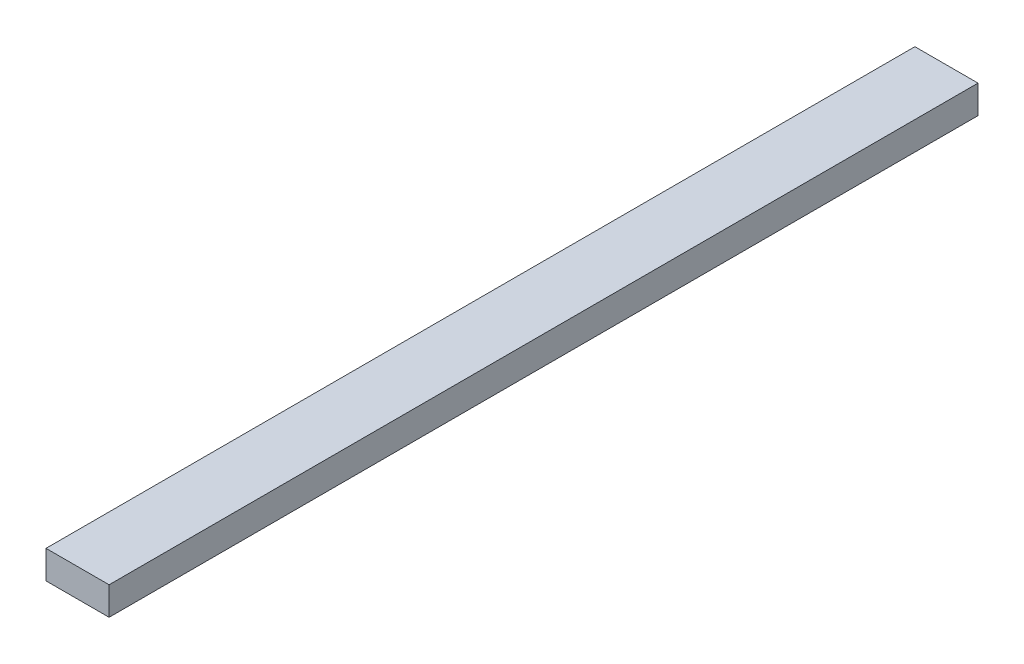
ISO-10303-21;
HEADER;
FILE_DESCRIPTION(('STEP AP214'),'2;1');
FILE_NAME('part.step','',(''),(''),'','','');
FILE_SCHEMA(('AUTOMOTIVE_DESIGN { 1 0 10303 214 1 1 1 1 }'));
ENDSEC;
DATA;
#1=APPLICATION_CONTEXT('core data for automotive mechanical design processes');
#2=APPLICATION_PROTOCOL_DEFINITION('international standard','automotive_design',2000,#1);
#3=PRODUCT_CONTEXT('',#1,'mechanical');
#4=PRODUCT('Part','Part','',(#3));
#5=PRODUCT_RELATED_PRODUCT_CATEGORY('part','',(#4));
#6=PRODUCT_DEFINITION_FORMATION('','',#4);
#7=PRODUCT_DEFINITION_CONTEXT('part definition',#1,'design');
#8=PRODUCT_DEFINITION('design','',#6,#7);
#9=PRODUCT_DEFINITION_SHAPE('','',#8);
#10=(LENGTH_UNIT() NAMED_UNIT(*) SI_UNIT(.MILLI.,.METRE.));
#11=(NAMED_UNIT(*) PLANE_ANGLE_UNIT() SI_UNIT($,.RADIAN.));
#12=(NAMED_UNIT(*) SI_UNIT($,.STERADIAN.) SOLID_ANGLE_UNIT());
#13=UNCERTAINTY_MEASURE_WITH_UNIT(LENGTH_MEASURE(1.E-05),#10,'distance_accuracy_value','');
#14=(GEOMETRIC_REPRESENTATION_CONTEXT(3) GLOBAL_UNCERTAINTY_ASSIGNED_CONTEXT((#13)) GLOBAL_UNIT_ASSIGNED_CONTEXT((#10,
#11,#12)) REPRESENTATION_CONTEXT('',''));
#15=CARTESIAN_POINT('',(0.,0.,0.));
#16=DIRECTION('',(0.,0.,1.));
#17=DIRECTION('',(1.,0.,0.));
#18=AXIS2_PLACEMENT_3D('',#15,#16,#17);
#19=CARTESIAN_POINT('',(18.6436,8.3312,256.67));
#20=DIRECTION('',(0.,-1.,0.));
#21=DIRECTION('',(0.,0.,-1.));
#22=AXIS2_PLACEMENT_3D('',#19,#20,#21);
#23=PLANE('',#22);
#24=DIRECTION('',(-1.,0.,0.));
#25=VECTOR('',#24,1.);
#26=CARTESIAN_POINT('',(18.6436,8.3312,-256.67));
#27=LINE('',#26,#25);
#28=CARTESIAN_POINT('',(18.6436,8.3312,-256.67));
#29=VERTEX_POINT('',#28);
#30=CARTESIAN_POINT('',(-18.6436,8.3312,-256.67));
#31=VERTEX_POINT('',#30);
#32=EDGE_CURVE('E102',#29,#31,#27,.T.);
#33=ORIENTED_EDGE('',*,*,#32,.T.);
#34=DIRECTION('',(0.,0.,-1.));
#35=VECTOR('',#34,1.);
#36=CARTESIAN_POINT('',(-18.6436,8.3312,256.67));
#37=LINE('',#36,#35);
#38=CARTESIAN_POINT('',(-18.6436,8.3312,256.67));
#39=VERTEX_POINT('',#38);
#40=EDGE_CURVE('E11',#39,#31,#37,.T.);
#41=ORIENTED_EDGE('',*,*,#40,.F.);
#42=DIRECTION('',(-1.,0.,0.));
#43=VECTOR('',#42,1.);
#44=CARTESIAN_POINT('',(18.6436,8.3312,256.67));
#45=LINE('',#44,#43);
#46=CARTESIAN_POINT('',(18.6436,8.3312,256.67));
#47=VERTEX_POINT('',#46);
#48=EDGE_CURVE('E95',#47,#39,#45,.T.);
#49=ORIENTED_EDGE('',*,*,#48,.F.);
#50=DIRECTION('',(0.,0.,-1.));
#51=VECTOR('',#50,1.);
#52=CARTESIAN_POINT('',(18.6436,8.3312,256.67));
#53=LINE('',#52,#51);
#54=EDGE_CURVE('E99',#47,#29,#53,.T.);
#55=ORIENTED_EDGE('',*,*,#54,.T.);
#56=EDGE_LOOP('',(#33,#41,#49,#55));
#57=FACE_BOUND('',#56,.T.);
#58=ADVANCED_FACE('F41',(#57),#23,.F.);
#59=CARTESIAN_POINT('',(-18.6436,-8.3312,256.67));
#60=DIRECTION('',(1.,0.,0.));
#61=DIRECTION('',(0.,0.,-1.));
#62=AXIS2_PLACEMENT_3D('',#59,#60,#61);
#63=PLANE('',#62);
#64=DIRECTION('',(0.,-1.,0.));
#65=VECTOR('',#64,1.);
#66=CARTESIAN_POINT('',(-18.6436,-8.3312,-256.67));
#67=LINE('',#66,#65);
#68=CARTESIAN_POINT('',(-18.6436,-8.3312,-256.67));
#69=VERTEX_POINT('',#68);
#70=EDGE_CURVE('E96',#31,#69,#67,.T.);
#71=ORIENTED_EDGE('',*,*,#70,.T.);
#72=DIRECTION('',(0.,0.,-1.));
#73=VECTOR('',#72,1.);
#74=CARTESIAN_POINT('',(-18.6436,-8.3312,256.67));
#75=LINE('',#74,#73);
#76=CARTESIAN_POINT('',(-18.6436,-8.3312,256.67));
#77=VERTEX_POINT('',#76);
#78=EDGE_CURVE('E47',#77,#69,#75,.T.);
#79=ORIENTED_EDGE('',*,*,#78,.F.);
#80=DIRECTION('',(0.,-1.,0.));
#81=VECTOR('',#80,1.);
#82=CARTESIAN_POINT('',(-18.6436,-8.3312,256.67));
#83=LINE('',#82,#81);
#84=EDGE_CURVE('E87',#39,#77,#83,.T.);
#85=ORIENTED_EDGE('',*,*,#84,.F.);
#86=ORIENTED_EDGE('',*,*,#40,.T.);
#87=EDGE_LOOP('',(#71,#79,#85,#86));
#88=FACE_BOUND('',#87,.T.);
#89=ADVANCED_FACE('F92',(#88),#63,.F.);
#90=CARTESIAN_POINT('',(18.6436,-8.3312,256.67));
#91=DIRECTION('',(0.,1.,0.));
#92=DIRECTION('',(0.,0.,1.));
#93=AXIS2_PLACEMENT_3D('',#90,#91,#92);
#94=PLANE('',#93);
#95=DIRECTION('',(1.,0.,0.));
#96=VECTOR('',#95,1.);
#97=CARTESIAN_POINT('',(18.6436,-8.3312,-256.67));
#98=LINE('',#97,#96);
#99=CARTESIAN_POINT('',(18.6436,-8.3312,-256.67));
#100=VERTEX_POINT('',#99);
#101=EDGE_CURVE('E74',#69,#100,#98,.T.);
#102=ORIENTED_EDGE('',*,*,#101,.T.);
#103=DIRECTION('',(0.,0.,-1.));
#104=VECTOR('',#103,1.);
#105=CARTESIAN_POINT('',(18.6436,-8.3312,256.67));
#106=LINE('',#105,#104);
#107=CARTESIAN_POINT('',(18.6436,-8.3312,256.67));
#108=VERTEX_POINT('',#107);
#109=EDGE_CURVE('E100',#108,#100,#106,.T.);
#110=ORIENTED_EDGE('',*,*,#109,.F.);
#111=DIRECTION('',(1.,0.,0.));
#112=VECTOR('',#111,1.);
#113=CARTESIAN_POINT('',(18.6436,-8.3312,256.67));
#114=LINE('',#113,#112);
#115=EDGE_CURVE('E89',#77,#108,#114,.T.);
#116=ORIENTED_EDGE('',*,*,#115,.F.);
#117=ORIENTED_EDGE('',*,*,#78,.T.);
#118=EDGE_LOOP('',(#102,#110,#116,#117));
#119=FACE_BOUND('',#118,.T.);
#120=ADVANCED_FACE('F98',(#119),#94,.F.);
#121=CARTESIAN_POINT('',(18.6436,-8.3312,256.67));
#122=DIRECTION('',(-1.,0.,0.));
#123=DIRECTION('',(0.,0.,1.));
#124=AXIS2_PLACEMENT_3D('',#121,#122,#123);
#125=PLANE('',#124);
#126=DIRECTION('',(0.,1.,0.));
#127=VECTOR('',#126,1.);
#128=CARTESIAN_POINT('',(18.6436,-8.3312,-256.67));
#129=LINE('',#128,#127);
#130=EDGE_CURVE('E79',#100,#29,#129,.T.);
#131=ORIENTED_EDGE('',*,*,#130,.T.);
#132=ORIENTED_EDGE('',*,*,#54,.F.);
#133=DIRECTION('',(0.,1.,0.));
#134=VECTOR('',#133,1.);
#135=CARTESIAN_POINT('',(18.6436,-8.3312,256.67));
#136=LINE('',#135,#134);
#137=EDGE_CURVE('E60',#108,#47,#136,.T.);
#138=ORIENTED_EDGE('',*,*,#137,.F.);
#139=ORIENTED_EDGE('',*,*,#109,.T.);
#140=EDGE_LOOP('',(#131,#132,#138,#139));
#141=FACE_BOUND('',#140,.T.);
#142=ADVANCED_FACE('F112',(#141),#125,.F.);
#143=CARTESIAN_POINT('',(0.,0.,256.67));
#144=DIRECTION('',(0.,0.,-1.));
#145=DIRECTION('',(-1.,0.,0.));
#146=AXIS2_PLACEMENT_3D('',#143,#144,#145);
#147=PLANE('',#146);
#148=ORIENTED_EDGE('',*,*,#48,.T.);
#149=ORIENTED_EDGE('',*,*,#84,.T.);
#150=ORIENTED_EDGE('',*,*,#115,.T.);
#151=ORIENTED_EDGE('',*,*,#137,.T.);
#152=EDGE_LOOP('',(#148,#149,#150,#151));
#153=FACE_BOUND('',#152,.T.);
#154=ADVANCED_FACE('F86',(#153),#147,.F.);
#155=CARTESIAN_POINT('',(0.,0.,-256.67));
#156=DIRECTION('',(0.,0.,-1.));
#157=DIRECTION('',(-1.,0.,0.));
#158=AXIS2_PLACEMENT_3D('',#155,#156,#157);
#159=PLANE('',#158);
#160=ORIENTED_EDGE('',*,*,#32,.F.);
#161=ORIENTED_EDGE('',*,*,#130,.F.);
#162=ORIENTED_EDGE('',*,*,#101,.F.);
#163=ORIENTED_EDGE('',*,*,#70,.F.);
#164=EDGE_LOOP('',(#160,#161,#162,#163));
#165=FACE_BOUND('',#164,.T.);
#166=ADVANCED_FACE('F111',(#165),#159,.T.);
#167=CLOSED_SHELL('',(#58,#89,#120,#142,#154,#166));
#168=MANIFOLD_SOLID_BREP('B2',#167);
#169=ADVANCED_BREP_SHAPE_REPRESENTATION('',(#18,#168),#14);
#170=SHAPE_DEFINITION_REPRESENTATION(#9,#169);
ENDSEC;
END-ISO-10303-21;
